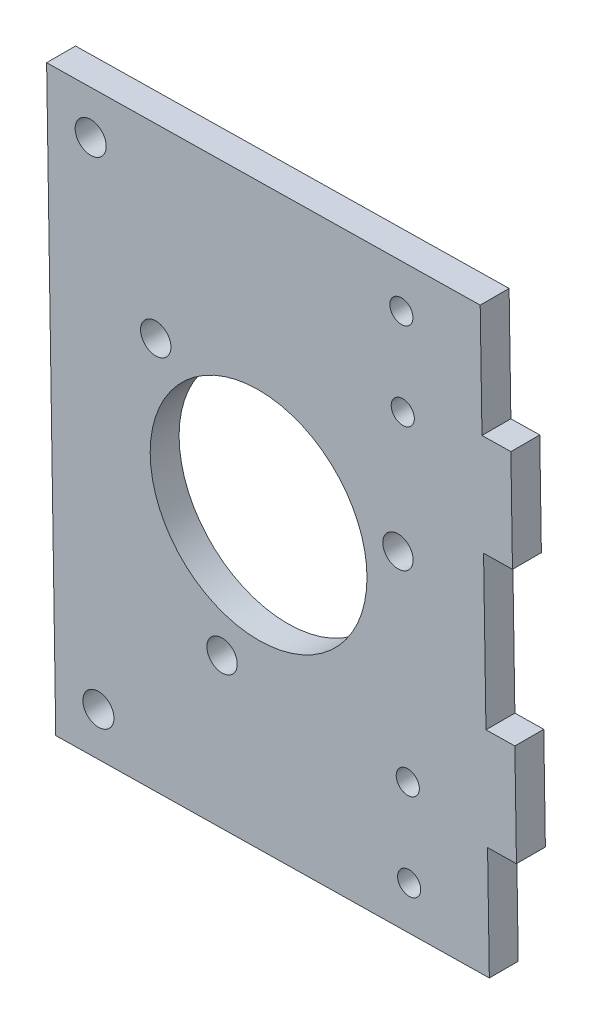
ISO-10303-21;
HEADER;
FILE_DESCRIPTION(('STEP AP214'),'2;1');
FILE_NAME('part.step','',(''),(''),'','','');
FILE_SCHEMA(('AUTOMOTIVE_DESIGN { 1 0 10303 214 1 1 1 1 }'));
ENDSEC;
DATA;
#1=APPLICATION_CONTEXT('core data for automotive mechanical design processes');
#2=APPLICATION_PROTOCOL_DEFINITION('international standard','automotive_design',2000,#1);
#3=PRODUCT_CONTEXT('',#1,'mechanical');
#4=PRODUCT('Part','Part','',(#3));
#5=PRODUCT_RELATED_PRODUCT_CATEGORY('part','',(#4));
#6=PRODUCT_DEFINITION_FORMATION('','',#4);
#7=PRODUCT_DEFINITION_CONTEXT('part definition',#1,'design');
#8=PRODUCT_DEFINITION('design','',#6,#7);
#9=PRODUCT_DEFINITION_SHAPE('','',#8);
#10=(LENGTH_UNIT() NAMED_UNIT(*) SI_UNIT(.MILLI.,.METRE.));
#11=(NAMED_UNIT(*) PLANE_ANGLE_UNIT() SI_UNIT($,.RADIAN.));
#12=(NAMED_UNIT(*) SI_UNIT($,.STERADIAN.) SOLID_ANGLE_UNIT());
#13=UNCERTAINTY_MEASURE_WITH_UNIT(LENGTH_MEASURE(1.E-05),#10,'distance_accuracy_value','');
#14=(GEOMETRIC_REPRESENTATION_CONTEXT(3) GLOBAL_UNCERTAINTY_ASSIGNED_CONTEXT((#13)) GLOBAL_UNIT_ASSIGNED_CONTEXT((#10,
#11,#12)) REPRESENTATION_CONTEXT('',''));
#15=CARTESIAN_POINT('',(0.,0.,0.));
#16=DIRECTION('',(0.,0.,1.));
#17=DIRECTION('',(1.,0.,0.));
#18=AXIS2_PLACEMENT_3D('',#15,#16,#17);
#19=CARTESIAN_POINT('',(131.137809217467,89.3742511928795,4.));
#20=DIRECTION('',(-0.99987539107056,-0.0157861436549556,0.));
#21=DIRECTION('',(0.0157861436549556,-0.99987539107056,0.));
#22=AXIS2_PLACEMENT_3D('',#19,#20,#21);
#23=PLANE('',#22);
#24=DIRECTION('',(-0.0157861436549556,0.99987539107056,0.));
#25=VECTOR('',#24,1.);
#26=CARTESIAN_POINT('',(131.137809217467,89.3742511928795,0.));
#27=LINE('',#26,#25);
#28=CARTESIAN_POINT('',(131.934981929288,38.8822884688284,0.));
#29=VERTEX_POINT('',#28);
#30=CARTESIAN_POINT('',(131.603500455289,59.8779271562981,0.));
#31=VERTEX_POINT('',#30);
#32=EDGE_CURVE('E271',#29,#31,#27,.T.);
#33=ORIENTED_EDGE('',*,*,#32,.T.);
#34=DIRECTION('',(0.,0.,1.));
#35=VECTOR('',#34,1.);
#36=CARTESIAN_POINT('',(131.603500455288,59.8779271562981,0.));
#37=LINE('',#36,#35);
#38=CARTESIAN_POINT('',(131.603500455289,59.8779271562981,4.));
#39=VERTEX_POINT('',#38);
#40=EDGE_CURVE('E58',#31,#39,#37,.T.);
#41=ORIENTED_EDGE('',*,*,#40,.T.);
#42=DIRECTION('',(-0.0157861436549556,0.99987539107056,0.));
#43=VECTOR('',#42,1.);
#44=CARTESIAN_POINT('',(131.137809217467,89.3742511928795,4.));
#45=LINE('',#44,#43);
#46=CARTESIAN_POINT('',(131.934981929288,38.8822884688284,4.));
#47=VERTEX_POINT('',#46);
#48=EDGE_CURVE('E261',#47,#39,#45,.T.);
#49=ORIENTED_EDGE('',*,*,#48,.F.);
#50=DIRECTION('',(0.,0.,1.));
#51=VECTOR('',#50,1.);
#52=CARTESIAN_POINT('',(131.934981929288,38.8822884688284,0.));
#53=LINE('',#52,#51);
#54=EDGE_CURVE('E184',#29,#47,#53,.T.);
#55=ORIENTED_EDGE('',*,*,#54,.F.);
#56=EDGE_LOOP('',(#33,#41,#49,#55));
#57=FACE_BOUND('',#56,.T.);
#58=ADVANCED_FACE('F35',(#57),#23,.F.);
#59=CARTESIAN_POINT('',(131.382494444119,73.8761826312859,4.));
#60=VERTEX_POINT('',#59);
#61=CARTESIAN_POINT('',(131.137809217467,89.3742511928795,4.));
#62=VERTEX_POINT('',#61);
#63=EDGE_CURVE('E50',#60,#62,#45,.T.);
#64=ORIENTED_EDGE('',*,*,#63,.F.);
#65=DIRECTION('',(0.,0.,1.));
#66=VECTOR('',#65,1.);
#67=CARTESIAN_POINT('',(131.382494444119,73.8761826312859,0.));
#68=LINE('',#67,#66);
#69=CARTESIAN_POINT('',(131.382494444119,73.8761826312859,0.));
#70=VERTEX_POINT('',#69);
#71=EDGE_CURVE('E160',#70,#60,#68,.T.);
#72=ORIENTED_EDGE('',*,*,#71,.F.);
#73=CARTESIAN_POINT('',(131.137809217467,89.3742511928795,0.));
#74=VERTEX_POINT('',#73);
#75=EDGE_CURVE('E268',#70,#74,#27,.T.);
#76=ORIENTED_EDGE('',*,*,#75,.T.);
#77=DIRECTION('',(0.,0.,-1.));
#78=VECTOR('',#77,1.);
#79=CARTESIAN_POINT('',(131.137809217467,89.3742511928795,4.));
#80=LINE('',#79,#78);
#81=EDGE_CURVE('E260',#62,#74,#80,.T.);
#82=ORIENTED_EDGE('',*,*,#81,.F.);
#83=EDGE_LOOP('',(#64,#72,#76,#82));
#84=FACE_BOUND('',#83,.T.);
#85=ADVANCED_FACE('F296',(#84),#23,.F.);
#86=CARTESIAN_POINT('',(71.1452857532338,88.4270825735822,4.));
#87=DIRECTION('',(0.015786143654956,-0.99987539107056,0.));
#88=DIRECTION('',(0.99987539107056,0.015786143654956,0.));
#89=AXIS2_PLACEMENT_3D('',#86,#87,#88);
#90=PLANE('',#89);
#91=DIRECTION('',(-0.99987539107056,-0.015786143654956,0.));
#92=VECTOR('',#91,1.);
#93=CARTESIAN_POINT('',(71.1452857532338,88.4270825735822,0.));
#94=LINE('',#93,#92);
#95=CARTESIAN_POINT('',(71.1452857532338,88.4270825735822,0.));
#96=VERTEX_POINT('',#95);
#97=EDGE_CURVE('E246',#74,#96,#94,.T.);
#98=ORIENTED_EDGE('',*,*,#97,.T.);
#99=DIRECTION('',(0.,0.,-1.));
#100=VECTOR('',#99,1.);
#101=CARTESIAN_POINT('',(71.1452857532338,88.4270825735822,4.));
#102=LINE('',#101,#100);
#103=CARTESIAN_POINT('',(71.1452857532338,88.4270825735822,4.));
#104=VERTEX_POINT('',#103);
#105=EDGE_CURVE('E11',#104,#96,#102,.T.);
#106=ORIENTED_EDGE('',*,*,#105,.F.);
#107=DIRECTION('',(-0.99987539107056,-0.015786143654956,0.));
#108=VECTOR('',#107,1.);
#109=CARTESIAN_POINT('',(71.1452857532338,88.4270825735822,4.));
#110=LINE('',#109,#108);
#111=EDGE_CURVE('E249',#62,#104,#110,.T.);
#112=ORIENTED_EDGE('',*,*,#111,.F.);
#113=ORIENTED_EDGE('',*,*,#81,.T.);
#114=EDGE_LOOP('',(#98,#106,#112,#113));
#115=FACE_BOUND('',#114,.T.);
#116=ADVANCED_FACE('F37',(#115),#90,.F.);
#117=CARTESIAN_POINT('',(72.4083346327989,8.42708257358218,4.));
#118=DIRECTION('',(0.99987539107056,0.0157861436549556,0.));
#119=DIRECTION('',(-0.0157861436549556,0.99987539107056,0.));
#120=AXIS2_PLACEMENT_3D('',#117,#118,#119);
#121=PLANE('',#120);
#122=DIRECTION('',(0.0157861436549556,-0.99987539107056,0.));
#123=VECTOR('',#122,1.);
#124=CARTESIAN_POINT('',(72.4083346327989,8.42708257358218,0.));
#125=LINE('',#124,#123);
#126=CARTESIAN_POINT('',(72.4083346327989,8.42708257358218,0.));
#127=VERTEX_POINT('',#126);
#128=EDGE_CURVE('E264',#96,#127,#125,.T.);
#129=ORIENTED_EDGE('',*,*,#128,.T.);
#130=DIRECTION('',(0.,0.,-1.));
#131=VECTOR('',#130,1.);
#132=CARTESIAN_POINT('',(72.4083346327989,8.42708257358218,4.));
#133=LINE('',#132,#131);
#134=CARTESIAN_POINT('',(72.4083346327989,8.42708257358218,4.));
#135=VERTEX_POINT('',#134);
#136=EDGE_CURVE('E43',#135,#127,#133,.T.);
#137=ORIENTED_EDGE('',*,*,#136,.F.);
#138=DIRECTION('',(0.0157861436549556,-0.99987539107056,0.));
#139=VECTOR('',#138,1.);
#140=CARTESIAN_POINT('',(72.4083346327989,8.42708257358218,4.));
#141=LINE('',#140,#139);
#142=EDGE_CURVE('E252',#104,#135,#141,.T.);
#143=ORIENTED_EDGE('',*,*,#142,.F.);
#144=ORIENTED_EDGE('',*,*,#105,.T.);
#145=EDGE_LOOP('',(#129,#137,#143,#144));
#146=FACE_BOUND('',#145,.T.);
#147=ADVANCED_FACE('F294',(#146),#121,.F.);
#148=CARTESIAN_POINT('',(132.400858097033,9.37425119287953,4.));
#149=DIRECTION('',(-0.0157861436549559,0.99987539107056,0.));
#150=DIRECTION('',(-0.99987539107056,-0.0157861436549559,0.));
#151=AXIS2_PLACEMENT_3D('',#148,#149,#150);
#152=PLANE('',#151);
#153=DIRECTION('',(0.99987539107056,0.0157861436549559,0.));
#154=VECTOR('',#153,1.);
#155=CARTESIAN_POINT('',(132.400858097033,9.37425119287953,0.));
#156=LINE('',#155,#154);
#157=CARTESIAN_POINT('',(132.400858097033,9.37425119287953,0.));
#158=VERTEX_POINT('',#157);
#159=EDGE_CURVE('E266',#127,#158,#156,.T.);
#160=ORIENTED_EDGE('',*,*,#159,.T.);
#161=DIRECTION('',(0.,0.,-1.));
#162=VECTOR('',#161,1.);
#163=CARTESIAN_POINT('',(132.400858097033,9.37425119287953,4.));
#164=LINE('',#163,#162);
#165=CARTESIAN_POINT('',(132.400858097033,9.37425119287953,4.));
#166=VERTEX_POINT('',#165);
#167=EDGE_CURVE('E274',#166,#158,#164,.T.);
#168=ORIENTED_EDGE('',*,*,#167,.F.);
#169=DIRECTION('',(0.99987539107056,0.0157861436549559,0.));
#170=VECTOR('',#169,1.);
#171=CARTESIAN_POINT('',(132.400858097033,9.37425119287953,4.));
#172=LINE('',#171,#170);
#173=EDGE_CURVE('E255',#135,#166,#172,.T.);
#174=ORIENTED_EDGE('',*,*,#173,.F.);
#175=ORIENTED_EDGE('',*,*,#136,.T.);
#176=EDGE_LOOP('',(#160,#168,#174,#175));
#177=FACE_BOUND('',#176,.T.);
#178=ADVANCED_FACE('F281',(#177),#152,.F.);
#179=CARTESIAN_POINT('',(132.156015483212,24.8822884688284,0.));
#180=VERTEX_POINT('',#179);
#181=EDGE_CURVE('E253',#158,#180,#27,.T.);
#182=ORIENTED_EDGE('',*,*,#181,.T.);
#183=DIRECTION('',(0.,0.,1.));
#184=VECTOR('',#183,1.);
#185=CARTESIAN_POINT('',(132.156015483212,24.8822884688284,0.));
#186=LINE('',#185,#184);
#187=CARTESIAN_POINT('',(132.156015483212,24.8822884688284,4.));
#188=VERTEX_POINT('',#187);
#189=EDGE_CURVE('E180',#180,#188,#186,.T.);
#190=ORIENTED_EDGE('',*,*,#189,.T.);
#191=EDGE_CURVE('E257',#166,#188,#45,.T.);
#192=ORIENTED_EDGE('',*,*,#191,.F.);
#193=ORIENTED_EDGE('',*,*,#167,.T.);
#194=EDGE_LOOP('',(#182,#190,#192,#193));
#195=FACE_BOUND('',#194,.T.);
#196=ADVANCED_FACE('F288',(#195),#23,.F.);
#197=CARTESIAN_POINT('',(0.,0.,4.));
#198=DIRECTION('',(0.,0.,-1.));
#199=DIRECTION('',(-1.,0.,0.));
#200=AXIS2_PLACEMENT_3D('',#197,#198,#199);
#201=PLANE('',#200);
#202=CARTESIAN_POINT('',(120.233896777621,83.2013512662517,4.));
#203=DIRECTION('',(0.,0.,1.));
#204=DIRECTION('',(1.,0.,0.));
#205=AXIS2_PLACEMENT_3D('',#202,#203,#204);
#206=CIRCLE('',#205,1.59999999999998);
#207=CARTESIAN_POINT('',(121.833896777621,83.2013512662517,4.));
#208=VERTEX_POINT('',#207);
#209=EDGE_CURVE('E193',#208,#208,#206,.T.);
#210=ORIENTED_EDGE('',*,*,#209,.F.);
#211=EDGE_LOOP('',(#210));
#212=FACE_BOUND('',#211,.T.);
#213=CARTESIAN_POINT('',(120.423330501481,71.202846573405,4.));
#214=DIRECTION('',(0.,0.,1.));
#215=DIRECTION('',(1.,0.,0.));
#216=AXIS2_PLACEMENT_3D('',#213,#214,#215);
#217=CIRCLE('',#216,1.60000000000001);
#218=CARTESIAN_POINT('',(122.023330501481,71.202846573405,4.));
#219=VERTEX_POINT('',#218);
#220=EDGE_CURVE('E199',#219,#219,#217,.T.);
#221=ORIENTED_EDGE('',*,*,#220,.F.);
#222=EDGE_LOOP('',(#221));
#223=FACE_BOUND('',#222,.T.);
#224=CARTESIAN_POINT('',(121.117920822299,27.2083293663004,4.));
#225=DIRECTION('',(0.,0.,1.));
#226=DIRECTION('',(1.,0.,0.));
#227=AXIS2_PLACEMENT_3D('',#224,#225,#226);
#228=CIRCLE('',#227,1.59999999999981);
#229=CARTESIAN_POINT('',(122.717920822299,27.2083293663004,4.));
#230=VERTEX_POINT('',#229);
#231=EDGE_CURVE('E205',#230,#230,#228,.T.);
#232=ORIENTED_EDGE('',*,*,#231,.F.);
#233=EDGE_LOOP('',(#232));
#234=FACE_BOUND('',#233,.T.);
#235=CARTESIAN_POINT('',(121.307354546158,15.2098246734537,4.));
#236=DIRECTION('',(0.,0.,1.));
#237=DIRECTION('',(1.,0.,0.));
#238=AXIS2_PLACEMENT_3D('',#235,#236,#237);
#239=CIRCLE('',#238,1.59999999999981);
#240=CARTESIAN_POINT('',(122.907354546158,15.2098246734537,4.));
#241=VERTEX_POINT('',#240);
#242=EDGE_CURVE('E183',#241,#241,#239,.T.);
#243=ORIENTED_EDGE('',*,*,#242,.F.);
#244=EDGE_LOOP('',(#243));
#245=FACE_BOUND('',#244,.T.);
#246=CARTESIAN_POINT('',(77.2392549615866,82.5225470890885,4.));
#247=DIRECTION('',(0.,0.,1.));
#248=DIRECTION('',(1.,0.,0.));
#249=AXIS2_PLACEMENT_3D('',#246,#247,#248);
#250=CIRCLE('',#249,2.15000000000023);
#251=CARTESIAN_POINT('',(79.3892549615868,82.5225470890885,4.));
#252=VERTEX_POINT('',#251);
#253=EDGE_CURVE('E217',#252,#252,#250,.T.);
#254=ORIENTED_EDGE('',*,*,#253,.F.);
#255=EDGE_LOOP('',(#254));
#256=FACE_BOUND('',#255,.T.);
#257=CARTESIAN_POINT('',(78.3127127301235,14.5310204962904,4.));
#258=DIRECTION('',(0.,0.,1.));
#259=DIRECTION('',(1.,0.,0.));
#260=AXIS2_PLACEMENT_3D('',#257,#258,#259);
#261=CIRCLE('',#260,2.15000000000025);
#262=CARTESIAN_POINT('',(80.4627127301238,14.5310204962904,4.));
#263=VERTEX_POINT('',#262);
#264=EDGE_CURVE('E192',#263,#263,#261,.T.);
#265=ORIENTED_EDGE('',*,*,#264,.F.);
#266=EDGE_LOOP('',(#265));
#267=FACE_BOUND('',#266,.T.);
#268=CARTESIAN_POINT('',(86.2434490278892,62.93897143192,4.));
#269=DIRECTION('',(0.,0.,1.));
#270=DIRECTION('',(1.,0.,0.));
#271=AXIS2_PLACEMENT_3D('',#268,#269,#270);
#272=CIRCLE('',#271,2.1);
#273=CARTESIAN_POINT('',(88.3434490278892,62.93897143192,4.));
#274=VERTEX_POINT('',#273);
#275=EDGE_CURVE('E216',#274,#274,#272,.T.);
#276=ORIENTED_EDGE('',*,*,#275,.F.);
#277=EDGE_LOOP('',(#276));
#278=FACE_BOUND('',#277,.T.);
#279=CARTESIAN_POINT('',(95.4172931269678,29.5347713300496,4.));
#280=DIRECTION('',(0.,0.,1.));
#281=DIRECTION('',(1.,0.,0.));
#282=AXIS2_PLACEMENT_3D('',#279,#280,#281);
#283=CIRCLE('',#282,2.1);
#284=CARTESIAN_POINT('',(97.5172931269678,29.5347713300496,4.));
#285=VERTEX_POINT('',#284);
#286=EDGE_CURVE('E235',#285,#285,#283,.T.);
#287=ORIENTED_EDGE('',*,*,#286,.F.);
#288=EDGE_LOOP('',(#287));
#289=FACE_BOUND('',#288,.T.);
#290=CARTESIAN_POINT('',(119.759256958747,54.1816534211447,4.));
#291=DIRECTION('',(0.,0.,1.));
#292=DIRECTION('',(1.,0.,0.));
#293=AXIS2_PLACEMENT_3D('',#290,#291,#292);
#294=CIRCLE('',#293,2.1);
#295=CARTESIAN_POINT('',(121.859256958747,54.1816534211447,4.));
#296=VERTEX_POINT('',#295);
#297=EDGE_CURVE('E229',#296,#296,#294,.T.);
#298=ORIENTED_EDGE('',*,*,#297,.F.);
#299=EDGE_LOOP('',(#298));
#300=FACE_BOUND('',#299,.T.);
#301=CARTESIAN_POINT('',(100.473333037857,48.8851320610159,4.));
#302=DIRECTION('',(0.,0.,1.));
#303=DIRECTION('',(1.,0.,0.));
#304=AXIS2_PLACEMENT_3D('',#301,#302,#303);
#305=CIRCLE('',#304,15.);
#306=CARTESIAN_POINT('',(115.473333037857,48.8851320610159,4.));
#307=VERTEX_POINT('',#306);
#308=EDGE_CURVE('E228',#307,#307,#305,.T.);
#309=ORIENTED_EDGE('',*,*,#308,.F.);
#310=EDGE_LOOP('',(#309));
#311=FACE_BOUND('',#310,.T.);
#312=ORIENTED_EDGE('',*,*,#111,.T.);
#313=ORIENTED_EDGE('',*,*,#142,.T.);
#314=ORIENTED_EDGE('',*,*,#173,.T.);
#315=ORIENTED_EDGE('',*,*,#191,.T.);
#316=DIRECTION('',(0.99987539107056,0.0157861436549555,0.));
#317=VECTOR('',#316,1.);
#318=CARTESIAN_POINT('',(132.156015483212,24.8822884688284,4.));
#319=LINE('',#318,#317);
#320=CARTESIAN_POINT('',(136.155517047494,24.9454330434482,4.));
#321=VERTEX_POINT('',#320);
#322=EDGE_CURVE('E159',#188,#321,#319,.T.);
#323=ORIENTED_EDGE('',*,*,#322,.T.);
#324=DIRECTION('',(-0.0157861436549565,0.99987539107056,0.));
#325=VECTOR('',#324,1.);
#326=CARTESIAN_POINT('',(136.155517047494,24.9454330434482,4.));
#327=LINE('',#326,#325);
#328=CARTESIAN_POINT('',(135.93448349357,38.9454330434482,4.));
#329=VERTEX_POINT('',#328);
#330=EDGE_CURVE('E175',#321,#329,#327,.T.);
#331=ORIENTED_EDGE('',*,*,#330,.T.);
#332=DIRECTION('',(-0.99987539107056,-0.0157861436549546,0.));
#333=VECTOR('',#332,1.);
#334=CARTESIAN_POINT('',(131.934981929288,38.8822884688284,4.));
#335=LINE('',#334,#333);
#336=EDGE_CURVE('E167',#329,#47,#335,.T.);
#337=ORIENTED_EDGE('',*,*,#336,.T.);
#338=ORIENTED_EDGE('',*,*,#48,.T.);
#339=DIRECTION('',(0.99987539107056,0.0157861436549218,0.));
#340=VECTOR('',#339,1.);
#341=CARTESIAN_POINT('',(131.603500455288,59.8779271562981,4.));
#342=LINE('',#341,#340);
#343=CARTESIAN_POINT('',(135.603002019571,59.9410717309178,4.));
#344=VERTEX_POINT('',#343);
#345=EDGE_CURVE('E155',#39,#344,#342,.T.);
#346=ORIENTED_EDGE('',*,*,#345,.T.);
#347=DIRECTION('',(-0.0157861436549548,0.99987539107056,0.));
#348=VECTOR('',#347,1.);
#349=CARTESIAN_POINT('',(135.603002019571,59.9410717309178,4.));
#350=LINE('',#349,#348);
#351=CARTESIAN_POINT('',(135.381996008401,73.9393272059056,4.));
#352=VERTEX_POINT('',#351);
#353=EDGE_CURVE('E131',#344,#352,#350,.T.);
#354=ORIENTED_EDGE('',*,*,#353,.T.);
#355=DIRECTION('',(-0.999875391070561,-0.0157861436549182,0.));
#356=VECTOR('',#355,1.);
#357=CARTESIAN_POINT('',(131.382494444119,73.8761826312859,4.));
#358=LINE('',#357,#356);
#359=EDGE_CURVE('E149',#352,#60,#358,.T.);
#360=ORIENTED_EDGE('',*,*,#359,.T.);
#361=ORIENTED_EDGE('',*,*,#63,.T.);
#362=EDGE_LOOP('',(#312,#313,#314,#315,#323,#331,#337,#338,#346,#354,#360,#361));
#363=FACE_BOUND('',#362,.T.);
#364=ADVANCED_FACE('F291',(#212,#223,#234,#245,#256,#267,#278,#289,#300,#311,#363),#201,.F.);
#365=CARTESIAN_POINT('',(0.,0.,0.));
#366=DIRECTION('',(0.,0.,-1.));
#367=DIRECTION('',(-1.,0.,0.));
#368=AXIS2_PLACEMENT_3D('',#365,#366,#367);
#369=PLANE('',#368);
#370=CARTESIAN_POINT('',(120.233896777621,83.2013512662517,0.));
#371=DIRECTION('',(0.,0.,1.));
#372=DIRECTION('',(1.,0.,0.));
#373=AXIS2_PLACEMENT_3D('',#370,#371,#372);
#374=CIRCLE('',#373,1.59999999999998);
#375=CARTESIAN_POINT('',(121.833896777621,83.2013512662517,0.));
#376=VERTEX_POINT('',#375);
#377=EDGE_CURVE('E189',#376,#376,#374,.T.);
#378=ORIENTED_EDGE('',*,*,#377,.T.);
#379=EDGE_LOOP('',(#378));
#380=FACE_BOUND('',#379,.T.);
#381=CARTESIAN_POINT('',(120.423330501481,71.202846573405,0.));
#382=DIRECTION('',(0.,0.,1.));
#383=DIRECTION('',(1.,0.,0.));
#384=AXIS2_PLACEMENT_3D('',#381,#382,#383);
#385=CIRCLE('',#384,1.60000000000001);
#386=CARTESIAN_POINT('',(122.023330501481,71.202846573405,0.));
#387=VERTEX_POINT('',#386);
#388=EDGE_CURVE('E196',#387,#387,#385,.T.);
#389=ORIENTED_EDGE('',*,*,#388,.T.);
#390=EDGE_LOOP('',(#389));
#391=FACE_BOUND('',#390,.T.);
#392=CARTESIAN_POINT('',(121.117920822299,27.2083293663004,0.));
#393=DIRECTION('',(0.,0.,1.));
#394=DIRECTION('',(1.,0.,0.));
#395=AXIS2_PLACEMENT_3D('',#392,#393,#394);
#396=CIRCLE('',#395,1.59999999999981);
#397=CARTESIAN_POINT('',(122.717920822299,27.2083293663004,0.));
#398=VERTEX_POINT('',#397);
#399=EDGE_CURVE('E202',#398,#398,#396,.T.);
#400=ORIENTED_EDGE('',*,*,#399,.T.);
#401=EDGE_LOOP('',(#400));
#402=FACE_BOUND('',#401,.T.);
#403=CARTESIAN_POINT('',(121.307354546158,15.2098246734537,0.));
#404=DIRECTION('',(0.,0.,1.));
#405=DIRECTION('',(1.,0.,0.));
#406=AXIS2_PLACEMENT_3D('',#403,#404,#405);
#407=CIRCLE('',#406,1.59999999999981);
#408=CARTESIAN_POINT('',(122.907354546158,15.2098246734537,0.));
#409=VERTEX_POINT('',#408);
#410=EDGE_CURVE('E208',#409,#409,#407,.T.);
#411=ORIENTED_EDGE('',*,*,#410,.T.);
#412=EDGE_LOOP('',(#411));
#413=FACE_BOUND('',#412,.T.);
#414=CARTESIAN_POINT('',(77.2392549615866,82.5225470890885,0.));
#415=DIRECTION('',(0.,0.,1.));
#416=DIRECTION('',(1.,0.,0.));
#417=AXIS2_PLACEMENT_3D('',#414,#415,#416);
#418=CIRCLE('',#417,2.15000000000023);
#419=CARTESIAN_POINT('',(79.3892549615868,82.5225470890885,0.));
#420=VERTEX_POINT('',#419);
#421=EDGE_CURVE('E213',#420,#420,#418,.T.);
#422=ORIENTED_EDGE('',*,*,#421,.T.);
#423=EDGE_LOOP('',(#422));
#424=FACE_BOUND('',#423,.T.);
#425=CARTESIAN_POINT('',(78.3127127301235,14.5310204962904,0.));
#426=DIRECTION('',(0.,0.,1.));
#427=DIRECTION('',(1.,0.,0.));
#428=AXIS2_PLACEMENT_3D('',#425,#426,#427);
#429=CIRCLE('',#428,2.15000000000025);
#430=CARTESIAN_POINT('',(80.4627127301238,14.5310204962904,0.));
#431=VERTEX_POINT('',#430);
#432=EDGE_CURVE('E220',#431,#431,#429,.T.);
#433=ORIENTED_EDGE('',*,*,#432,.T.);
#434=EDGE_LOOP('',(#433));
#435=FACE_BOUND('',#434,.T.);
#436=CARTESIAN_POINT('',(86.2434490278892,62.93897143192,0.));
#437=DIRECTION('',(0.,0.,1.));
#438=DIRECTION('',(1.,0.,0.));
#439=AXIS2_PLACEMENT_3D('',#436,#437,#438);
#440=CIRCLE('',#439,2.1);
#441=CARTESIAN_POINT('',(88.3434490278892,62.93897143192,0.));
#442=VERTEX_POINT('',#441);
#443=EDGE_CURVE('E238',#442,#442,#440,.T.);
#444=ORIENTED_EDGE('',*,*,#443,.T.);
#445=EDGE_LOOP('',(#444));
#446=FACE_BOUND('',#445,.T.);
#447=CARTESIAN_POINT('',(95.4172931269678,29.5347713300496,0.));
#448=DIRECTION('',(0.,0.,1.));
#449=DIRECTION('',(1.,0.,0.));
#450=AXIS2_PLACEMENT_3D('',#447,#448,#449);
#451=CIRCLE('',#450,2.1);
#452=CARTESIAN_POINT('',(97.5172931269678,29.5347713300496,0.));
#453=VERTEX_POINT('',#452);
#454=EDGE_CURVE('E232',#453,#453,#451,.T.);
#455=ORIENTED_EDGE('',*,*,#454,.T.);
#456=EDGE_LOOP('',(#455));
#457=FACE_BOUND('',#456,.T.);
#458=CARTESIAN_POINT('',(119.759256958747,54.1816534211447,0.));
#459=DIRECTION('',(0.,0.,1.));
#460=DIRECTION('',(1.,0.,0.));
#461=AXIS2_PLACEMENT_3D('',#458,#459,#460);
#462=CIRCLE('',#461,2.1);
#463=CARTESIAN_POINT('',(121.859256958747,54.1816534211447,0.));
#464=VERTEX_POINT('',#463);
#465=EDGE_CURVE('E225',#464,#464,#462,.T.);
#466=ORIENTED_EDGE('',*,*,#465,.T.);
#467=EDGE_LOOP('',(#466));
#468=FACE_BOUND('',#467,.T.);
#469=CARTESIAN_POINT('',(100.473333037857,48.8851320610159,0.));
#470=DIRECTION('',(0.,0.,1.));
#471=DIRECTION('',(1.,0.,0.));
#472=AXIS2_PLACEMENT_3D('',#469,#470,#471);
#473=CIRCLE('',#472,15.);
#474=CARTESIAN_POINT('',(115.473333037857,48.8851320610159,0.));
#475=VERTEX_POINT('',#474);
#476=EDGE_CURVE('E243',#475,#475,#473,.T.);
#477=ORIENTED_EDGE('',*,*,#476,.T.);
#478=EDGE_LOOP('',(#477));
#479=FACE_BOUND('',#478,.T.);
#480=ORIENTED_EDGE('',*,*,#97,.F.);
#481=ORIENTED_EDGE('',*,*,#75,.F.);
#482=DIRECTION('',(-0.999875391070561,-0.0157861436549182,0.));
#483=VECTOR('',#482,1.);
#484=CARTESIAN_POINT('',(131.382494444119,73.8761826312859,0.));
#485=LINE('',#484,#483);
#486=CARTESIAN_POINT('',(135.381996008401,73.9393272059056,0.));
#487=VERTEX_POINT('',#486);
#488=EDGE_CURVE('E137',#487,#70,#485,.T.);
#489=ORIENTED_EDGE('',*,*,#488,.F.);
#490=DIRECTION('',(-0.0157861436549548,0.99987539107056,0.));
#491=VECTOR('',#490,1.);
#492=CARTESIAN_POINT('',(135.603002019571,59.9410717309178,0.));
#493=LINE('',#492,#491);
#494=CARTESIAN_POINT('',(135.603002019571,59.9410717309178,0.));
#495=VERTEX_POINT('',#494);
#496=EDGE_CURVE('E129',#495,#487,#493,.T.);
#497=ORIENTED_EDGE('',*,*,#496,.F.);
#498=DIRECTION('',(0.99987539107056,0.0157861436549218,0.));
#499=VECTOR('',#498,1.);
#500=CARTESIAN_POINT('',(131.603500455288,59.8779271562981,0.));
#501=LINE('',#500,#499);
#502=EDGE_CURVE('E145',#31,#495,#501,.T.);
#503=ORIENTED_EDGE('',*,*,#502,.F.);
#504=ORIENTED_EDGE('',*,*,#32,.F.);
#505=DIRECTION('',(-0.99987539107056,-0.0157861436549546,0.));
#506=VECTOR('',#505,1.);
#507=CARTESIAN_POINT('',(131.934981929288,38.8822884688284,0.));
#508=LINE('',#507,#506);
#509=CARTESIAN_POINT('',(135.93448349357,38.9454330434482,0.));
#510=VERTEX_POINT('',#509);
#511=EDGE_CURVE('E170',#510,#29,#508,.T.);
#512=ORIENTED_EDGE('',*,*,#511,.F.);
#513=DIRECTION('',(-0.0157861436549565,0.99987539107056,0.));
#514=VECTOR('',#513,1.);
#515=CARTESIAN_POINT('',(136.155517047494,24.9454330434482,0.));
#516=LINE('',#515,#514);
#517=CARTESIAN_POINT('',(136.155517047494,24.9454330434482,0.));
#518=VERTEX_POINT('',#517);
#519=EDGE_CURVE('E166',#518,#510,#516,.T.);
#520=ORIENTED_EDGE('',*,*,#519,.F.);
#521=DIRECTION('',(0.99987539107056,0.0157861436549555,0.));
#522=VECTOR('',#521,1.);
#523=CARTESIAN_POINT('',(132.156015483212,24.8822884688284,0.));
#524=LINE('',#523,#522);
#525=EDGE_CURVE('E163',#180,#518,#524,.T.);
#526=ORIENTED_EDGE('',*,*,#525,.F.);
#527=ORIENTED_EDGE('',*,*,#181,.F.);
#528=ORIENTED_EDGE('',*,*,#159,.F.);
#529=ORIENTED_EDGE('',*,*,#128,.F.);
#530=EDGE_LOOP('',(#480,#481,#489,#497,#503,#504,#512,#520,#526,#527,#528,#529));
#531=FACE_BOUND('',#530,.T.);
#532=ADVANCED_FACE('F143',(#380,#391,#402,#413,#424,#435,#446,#457,#468,#479,#531),#369,.T.);
#533=CARTESIAN_POINT('',(100.473333037857,48.8851320610159,0.));
#534=DIRECTION('',(0.,0.,1.));
#535=DIRECTION('',(1.,0.,0.));
#536=AXIS2_PLACEMENT_3D('',#533,#534,#535);
#537=CYLINDRICAL_SURFACE('',#536,15.);
#538=ORIENTED_EDGE('',*,*,#476,.F.);
#539=EDGE_LOOP('',(#538));
#540=FACE_BOUND('',#539,.T.);
#541=ORIENTED_EDGE('',*,*,#308,.T.);
#542=EDGE_LOOP('',(#541));
#543=FACE_BOUND('',#542,.T.);
#544=ADVANCED_FACE('F374',(#540,#543),#537,.F.);
#545=CARTESIAN_POINT('',(119.759256958747,54.1816534211447,0.));
#546=DIRECTION('',(0.,0.,1.));
#547=DIRECTION('',(1.,0.,0.));
#548=AXIS2_PLACEMENT_3D('',#545,#546,#547);
#549=CYLINDRICAL_SURFACE('',#548,2.1);
#550=ORIENTED_EDGE('',*,*,#465,.F.);
#551=EDGE_LOOP('',(#550));
#552=FACE_BOUND('',#551,.T.);
#553=ORIENTED_EDGE('',*,*,#297,.T.);
#554=EDGE_LOOP('',(#553));
#555=FACE_BOUND('',#554,.T.);
#556=ADVANCED_FACE('F424',(#552,#555),#549,.F.);
#557=CARTESIAN_POINT('',(95.4172931269678,29.5347713300496,0.));
#558=DIRECTION('',(0.,0.,1.));
#559=DIRECTION('',(1.,0.,0.));
#560=AXIS2_PLACEMENT_3D('',#557,#558,#559);
#561=CYLINDRICAL_SURFACE('',#560,2.1);
#562=ORIENTED_EDGE('',*,*,#454,.F.);
#563=EDGE_LOOP('',(#562));
#564=FACE_BOUND('',#563,.T.);
#565=ORIENTED_EDGE('',*,*,#286,.T.);
#566=EDGE_LOOP('',(#565));
#567=FACE_BOUND('',#566,.T.);
#568=ADVANCED_FACE('F432',(#564,#567),#561,.F.);
#569=CARTESIAN_POINT('',(86.2434490278892,62.93897143192,0.));
#570=DIRECTION('',(0.,0.,1.));
#571=DIRECTION('',(1.,0.,0.));
#572=AXIS2_PLACEMENT_3D('',#569,#570,#571);
#573=CYLINDRICAL_SURFACE('',#572,2.1);
#574=ORIENTED_EDGE('',*,*,#443,.F.);
#575=EDGE_LOOP('',(#574));
#576=FACE_BOUND('',#575,.T.);
#577=ORIENTED_EDGE('',*,*,#275,.T.);
#578=EDGE_LOOP('',(#577));
#579=FACE_BOUND('',#578,.T.);
#580=ADVANCED_FACE('F440',(#576,#579),#573,.F.);
#581=CARTESIAN_POINT('',(78.3127127301235,14.5310204962904,0.));
#582=DIRECTION('',(0.,0.,1.));
#583=DIRECTION('',(1.,0.,0.));
#584=AXIS2_PLACEMENT_3D('',#581,#582,#583);
#585=CYLINDRICAL_SURFACE('',#584,2.15000000000025);
#586=ORIENTED_EDGE('',*,*,#432,.F.);
#587=EDGE_LOOP('',(#586));
#588=FACE_BOUND('',#587,.T.);
#589=ORIENTED_EDGE('',*,*,#264,.T.);
#590=EDGE_LOOP('',(#589));
#591=FACE_BOUND('',#590,.T.);
#592=ADVANCED_FACE('F448',(#588,#591),#585,.F.);
#593=CARTESIAN_POINT('',(77.2392549615866,82.5225470890885,0.));
#594=DIRECTION('',(0.,0.,1.));
#595=DIRECTION('',(1.,0.,0.));
#596=AXIS2_PLACEMENT_3D('',#593,#594,#595);
#597=CYLINDRICAL_SURFACE('',#596,2.15000000000023);
#598=ORIENTED_EDGE('',*,*,#421,.F.);
#599=EDGE_LOOP('',(#598));
#600=FACE_BOUND('',#599,.T.);
#601=ORIENTED_EDGE('',*,*,#253,.T.);
#602=EDGE_LOOP('',(#601));
#603=FACE_BOUND('',#602,.T.);
#604=ADVANCED_FACE('F456',(#600,#603),#597,.F.);
#605=CARTESIAN_POINT('',(121.307354546158,15.2098246734537,0.));
#606=DIRECTION('',(0.,0.,1.));
#607=DIRECTION('',(1.,0.,0.));
#608=AXIS2_PLACEMENT_3D('',#605,#606,#607);
#609=CYLINDRICAL_SURFACE('',#608,1.59999999999981);
#610=ORIENTED_EDGE('',*,*,#410,.F.);
#611=EDGE_LOOP('',(#610));
#612=FACE_BOUND('',#611,.T.);
#613=ORIENTED_EDGE('',*,*,#242,.T.);
#614=EDGE_LOOP('',(#613));
#615=FACE_BOUND('',#614,.T.);
#616=ADVANCED_FACE('F464',(#612,#615),#609,.F.);
#617=CARTESIAN_POINT('',(121.117920822299,27.2083293663004,0.));
#618=DIRECTION('',(0.,0.,1.));
#619=DIRECTION('',(1.,0.,0.));
#620=AXIS2_PLACEMENT_3D('',#617,#618,#619);
#621=CYLINDRICAL_SURFACE('',#620,1.59999999999981);
#622=ORIENTED_EDGE('',*,*,#399,.F.);
#623=EDGE_LOOP('',(#622));
#624=FACE_BOUND('',#623,.T.);
#625=ORIENTED_EDGE('',*,*,#231,.T.);
#626=EDGE_LOOP('',(#625));
#627=FACE_BOUND('',#626,.T.);
#628=ADVANCED_FACE('F472',(#624,#627),#621,.F.);
#629=CARTESIAN_POINT('',(120.423330501481,71.202846573405,0.));
#630=DIRECTION('',(0.,0.,1.));
#631=DIRECTION('',(1.,0.,0.));
#632=AXIS2_PLACEMENT_3D('',#629,#630,#631);
#633=CYLINDRICAL_SURFACE('',#632,1.60000000000001);
#634=ORIENTED_EDGE('',*,*,#388,.F.);
#635=EDGE_LOOP('',(#634));
#636=FACE_BOUND('',#635,.T.);
#637=ORIENTED_EDGE('',*,*,#220,.T.);
#638=EDGE_LOOP('',(#637));
#639=FACE_BOUND('',#638,.T.);
#640=ADVANCED_FACE('F318',(#636,#639),#633,.F.);
#641=CARTESIAN_POINT('',(120.233896777621,83.2013512662517,0.));
#642=DIRECTION('',(0.,0.,1.));
#643=DIRECTION('',(1.,0.,0.));
#644=AXIS2_PLACEMENT_3D('',#641,#642,#643);
#645=CYLINDRICAL_SURFACE('',#644,1.59999999999998);
#646=ORIENTED_EDGE('',*,*,#377,.F.);
#647=EDGE_LOOP('',(#646));
#648=FACE_BOUND('',#647,.T.);
#649=ORIENTED_EDGE('',*,*,#209,.T.);
#650=EDGE_LOOP('',(#649));
#651=FACE_BOUND('',#650,.T.);
#652=ADVANCED_FACE('F311',(#648,#651),#645,.F.);
#653=CARTESIAN_POINT('',(132.156015483212,24.8822884688284,0.));
#654=DIRECTION('',(0.0157861436549555,-0.99987539107056,0.));
#655=DIRECTION('',(0.99987539107056,0.0157861436549555,0.));
#656=AXIS2_PLACEMENT_3D('',#653,#654,#655);
#657=PLANE('',#656);
#658=ORIENTED_EDGE('',*,*,#322,.F.);
#659=ORIENTED_EDGE('',*,*,#189,.F.);
#660=ORIENTED_EDGE('',*,*,#525,.T.);
#661=DIRECTION('',(0.,0.,1.));
#662=VECTOR('',#661,1.);
#663=CARTESIAN_POINT('',(136.155517047494,24.9454330434482,0.));
#664=LINE('',#663,#662);
#665=EDGE_CURVE('E172',#518,#321,#664,.T.);
#666=ORIENTED_EDGE('',*,*,#665,.T.);
#667=EDGE_LOOP('',(#658,#659,#660,#666));
#668=FACE_BOUND('',#667,.T.);
#669=ADVANCED_FACE('F308',(#668),#657,.T.);
#670=CARTESIAN_POINT('',(131.934981929288,38.8822884688284,0.));
#671=DIRECTION('',(-0.0157861436549546,0.99987539107056,0.));
#672=DIRECTION('',(-0.99987539107056,-0.0157861436549546,0.));
#673=AXIS2_PLACEMENT_3D('',#670,#671,#672);
#674=PLANE('',#673);
#675=ORIENTED_EDGE('',*,*,#336,.F.);
#676=DIRECTION('',(0.,0.,1.));
#677=VECTOR('',#676,1.);
#678=CARTESIAN_POINT('',(135.93448349357,38.9454330434482,0.));
#679=LINE('',#678,#677);
#680=EDGE_CURVE('E186',#510,#329,#679,.T.);
#681=ORIENTED_EDGE('',*,*,#680,.F.);
#682=ORIENTED_EDGE('',*,*,#511,.T.);
#683=ORIENTED_EDGE('',*,*,#54,.T.);
#684=EDGE_LOOP('',(#675,#681,#682,#683));
#685=FACE_BOUND('',#684,.T.);
#686=ADVANCED_FACE('F310',(#685),#674,.T.);
#687=CARTESIAN_POINT('',(136.155517047494,24.9454330434482,0.));
#688=DIRECTION('',(0.99987539107056,0.0157861436549565,0.));
#689=DIRECTION('',(-0.0157861436549565,0.99987539107056,0.));
#690=AXIS2_PLACEMENT_3D('',#687,#688,#689);
#691=PLANE('',#690);
#692=ORIENTED_EDGE('',*,*,#330,.F.);
#693=ORIENTED_EDGE('',*,*,#665,.F.);
#694=ORIENTED_EDGE('',*,*,#519,.T.);
#695=ORIENTED_EDGE('',*,*,#680,.T.);
#696=EDGE_LOOP('',(#692,#693,#694,#695));
#697=FACE_BOUND('',#696,.T.);
#698=ADVANCED_FACE('F306',(#697),#691,.T.);
#699=CARTESIAN_POINT('',(131.603500455288,59.8779271562981,0.));
#700=DIRECTION('',(0.0157861436549218,-0.999875391070561,0.));
#701=DIRECTION('',(0.999875391070561,0.0157861436549218,0.));
#702=AXIS2_PLACEMENT_3D('',#699,#700,#701);
#703=PLANE('',#702);
#704=ORIENTED_EDGE('',*,*,#345,.F.);
#705=ORIENTED_EDGE('',*,*,#40,.F.);
#706=ORIENTED_EDGE('',*,*,#502,.T.);
#707=DIRECTION('',(0.,0.,1.));
#708=VECTOR('',#707,1.);
#709=CARTESIAN_POINT('',(135.603002019571,59.9410717309178,0.));
#710=LINE('',#709,#708);
#711=EDGE_CURVE('E126',#495,#344,#710,.T.);
#712=ORIENTED_EDGE('',*,*,#711,.T.);
#713=EDGE_LOOP('',(#704,#705,#706,#712));
#714=FACE_BOUND('',#713,.T.);
#715=ADVANCED_FACE('F148',(#714),#703,.T.);
#716=CARTESIAN_POINT('',(131.382494444119,73.8761826312859,0.));
#717=DIRECTION('',(-0.0157861436549182,0.999875391070561,0.));
#718=DIRECTION('',(-0.999875391070561,-0.0157861436549182,0.));
#719=AXIS2_PLACEMENT_3D('',#716,#717,#718);
#720=PLANE('',#719);
#721=ORIENTED_EDGE('',*,*,#359,.F.);
#722=DIRECTION('',(0.,0.,1.));
#723=VECTOR('',#722,1.);
#724=CARTESIAN_POINT('',(135.381996008401,73.9393272059056,0.));
#725=LINE('',#724,#723);
#726=EDGE_CURVE('E136',#487,#352,#725,.T.);
#727=ORIENTED_EDGE('',*,*,#726,.F.);
#728=ORIENTED_EDGE('',*,*,#488,.T.);
#729=ORIENTED_EDGE('',*,*,#71,.T.);
#730=EDGE_LOOP('',(#721,#727,#728,#729));
#731=FACE_BOUND('',#730,.T.);
#732=ADVANCED_FACE('F299',(#731),#720,.T.);
#733=CARTESIAN_POINT('',(135.603002019571,59.9410717309178,0.));
#734=DIRECTION('',(0.99987539107056,0.0157861436549548,0.));
#735=DIRECTION('',(-0.0157861436549548,0.99987539107056,0.));
#736=AXIS2_PLACEMENT_3D('',#733,#734,#735);
#737=PLANE('',#736);
#738=ORIENTED_EDGE('',*,*,#353,.F.);
#739=ORIENTED_EDGE('',*,*,#711,.F.);
#740=ORIENTED_EDGE('',*,*,#496,.T.);
#741=ORIENTED_EDGE('',*,*,#726,.T.);
#742=EDGE_LOOP('',(#738,#739,#740,#741));
#743=FACE_BOUND('',#742,.T.);
#744=ADVANCED_FACE('F128',(#743),#737,.T.);
#745=CLOSED_SHELL('',(#58,#85,#116,#147,#178,#196,#364,#532,#544,#556,#568,#580,#592,#604,#616,
#628,#640,#652,#669,#686,#698,#715,#732,#744));
#746=MANIFOLD_SOLID_BREP('B2',#745);
#747=ADVANCED_BREP_SHAPE_REPRESENTATION('',(#18,#746),#14);
#748=SHAPE_DEFINITION_REPRESENTATION(#9,#747);
ENDSEC;
END-ISO-10303-21;
